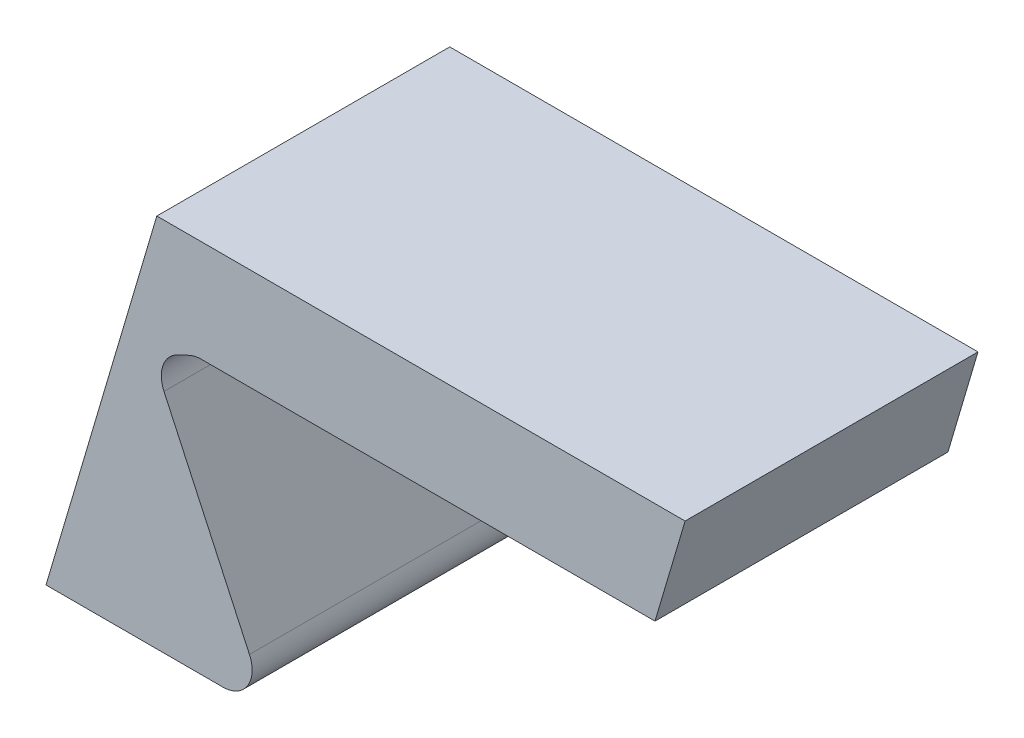
ISO-10303-21;
HEADER;
FILE_DESCRIPTION(('STEP AP214'),'2;1');
FILE_NAME('part.step','',(''),(''),'','','');
FILE_SCHEMA(('AUTOMOTIVE_DESIGN { 1 0 10303 214 1 1 1 1 }'));
ENDSEC;
DATA;
#1=APPLICATION_CONTEXT('core data for automotive mechanical design processes');
#2=APPLICATION_PROTOCOL_DEFINITION('international standard','automotive_design',2000,#1);
#3=PRODUCT_CONTEXT('',#1,'mechanical');
#4=PRODUCT('Part','Part','',(#3));
#5=PRODUCT_RELATED_PRODUCT_CATEGORY('part','',(#4));
#6=PRODUCT_DEFINITION_FORMATION('','',#4);
#7=PRODUCT_DEFINITION_CONTEXT('part definition',#1,'design');
#8=PRODUCT_DEFINITION('design','',#6,#7);
#9=PRODUCT_DEFINITION_SHAPE('','',#8);
#10=(LENGTH_UNIT() NAMED_UNIT(*) SI_UNIT(.MILLI.,.METRE.));
#11=(NAMED_UNIT(*) PLANE_ANGLE_UNIT() SI_UNIT($,.RADIAN.));
#12=(NAMED_UNIT(*) SI_UNIT($,.STERADIAN.) SOLID_ANGLE_UNIT());
#13=UNCERTAINTY_MEASURE_WITH_UNIT(LENGTH_MEASURE(1.E-05),#10,'distance_accuracy_value','');
#14=(GEOMETRIC_REPRESENTATION_CONTEXT(3) GLOBAL_UNCERTAINTY_ASSIGNED_CONTEXT((#13)) GLOBAL_UNIT_ASSIGNED_CONTEXT((#10,
#11,#12)) REPRESENTATION_CONTEXT('',''));
#15=CARTESIAN_POINT('',(0.,0.,0.));
#16=DIRECTION('',(0.,0.,1.));
#17=DIRECTION('',(1.,0.,0.));
#18=AXIS2_PLACEMENT_3D('',#15,#16,#17);
#19=CARTESIAN_POINT('',(-2.341839025816,-1.867497966332,0.));
#20=DIRECTION('',(0.,0.,1.));
#21=DIRECTION('',(0.842412213008179,-0.538833613812894,0.));
#22=AXIS2_PLACEMENT_3D('',#19,#20,#21);
#23=CYLINDRICAL_SURFACE('',#22,0.01);
#24=CARTESIAN_POINT('',(-2.341839025816,-1.867497966332,0.1));
#25=DIRECTION('',(0.,0.,-1.));
#26=DIRECTION('',(0.842412213008179,-0.538833613812894,0.));
#27=AXIS2_PLACEMENT_3D('',#24,#25,#26);
#28=CIRCLE('',#27,0.01);
#29=CARTESIAN_POINT('',(-2.332760625475,-1.8633047996,0.1));
#30=VERTEX_POINT('',#29);
#31=CARTESIAN_POINT('',(-2.341839025816,-1.877497966332,0.1));
#32=VERTEX_POINT('',#31);
#33=EDGE_CURVE('E11',#30,#32,#28,.T.);
#34=ORIENTED_EDGE('',*,*,#33,.T.);
#35=DIRECTION('',(0.,0.,-1.));
#36=VECTOR('',#35,1.);
#37=CARTESIAN_POINT('',(-2.341839025816,-1.877497966332,0.));
#38=LINE('',#37,#36);
#39=CARTESIAN_POINT('',(-2.341839025816,-1.877497966332,0.));
#40=VERTEX_POINT('',#39);
#41=EDGE_CURVE('E24',#32,#40,#38,.T.);
#42=ORIENTED_EDGE('',*,*,#41,.T.);
#43=CARTESIAN_POINT('',(-2.341839025816,-1.867497966332,0.));
#44=DIRECTION('',(0.,0.,1.));
#45=DIRECTION('',(0.842412213008179,-0.538833613812894,0.));
#46=AXIS2_PLACEMENT_3D('',#43,#44,#45);
#47=CIRCLE('',#46,0.01);
#48=CARTESIAN_POINT('',(-2.332760625475,-1.8633047996,0.));
#49=VERTEX_POINT('',#48);
#50=EDGE_CURVE('E174',#40,#49,#47,.T.);
#51=ORIENTED_EDGE('',*,*,#50,.T.);
#52=DIRECTION('',(0.,0.,1.));
#53=VECTOR('',#52,1.);
#54=CARTESIAN_POINT('',(-2.332760625475,-1.8633047996,0.));
#55=LINE('',#54,#53);
#56=EDGE_CURVE('E172',#49,#30,#55,.T.);
#57=ORIENTED_EDGE('',*,*,#56,.T.);
#58=EDGE_LOOP('',(#34,#42,#51,#57));
#59=FACE_BOUND('',#58,.T.);
#60=ADVANCED_FACE('F17',(#59),#23,.T.);
#61=CARTESIAN_POINT('',(-2.312122349708,-1.797075461806,0.));
#62=DIRECTION('',(0.,0.,1.));
#63=DIRECTION('',(1.,0.,0.));
#64=AXIS2_PLACEMENT_3D('',#61,#62,#63);
#65=PLANE('',#64);
#66=ORIENTED_EDGE('',*,*,#50,.F.);
#67=DIRECTION('',(1.,0.,0.));
#68=VECTOR('',#67,1.);
#69=CARTESIAN_POINT('',(-2.402222959671,-1.877497966332,0.));
#70=LINE('',#69,#68);
#71=CARTESIAN_POINT('',(-2.402222959671,-1.877497966332,0.));
#72=VERTEX_POINT('',#71);
#73=EDGE_CURVE('E169',#72,#40,#70,.T.);
#74=ORIENTED_EDGE('',*,*,#73,.F.);
#75=DIRECTION('',(-0.283427278082506,-0.958993732012228,0.));
#76=VECTOR('',#75,1.);
#77=CARTESIAN_POINT('',(-2.364390002153,-1.749487813712,0.));
#78=LINE('',#77,#76);
#79=CARTESIAN_POINT('',(-2.364390002153,-1.749487813712,0.));
#80=VERTEX_POINT('',#79);
#81=EDGE_CURVE('E167',#80,#72,#78,.T.);
#82=ORIENTED_EDGE('',*,*,#81,.F.);
#83=DIRECTION('',(-1.,0.,0.));
#84=VECTOR('',#83,1.);
#85=CARTESIAN_POINT('',(-2.184037518721,-1.749487813712,0.));
#86=LINE('',#85,#84);
#87=CARTESIAN_POINT('',(-2.184037518721,-1.749487813712,0.));
#88=VERTEX_POINT('',#87);
#89=EDGE_CURVE('E107',#88,#80,#86,.T.);
#90=ORIENTED_EDGE('',*,*,#89,.F.);
#91=DIRECTION('',(0.283427278082505,0.958993732012229,0.));
#92=VECTOR('',#91,1.);
#93=CARTESIAN_POINT('',(-2.194307302675,-1.784236263145,0.));
#94=LINE('',#93,#92);
#95=CARTESIAN_POINT('',(-2.194307302675,-1.784236263145,0.));
#96=VERTEX_POINT('',#95);
#97=EDGE_CURVE('E163',#96,#88,#94,.T.);
#98=ORIENTED_EDGE('',*,*,#97,.F.);
#99=DIRECTION('',(1.,0.,0.));
#100=VECTOR('',#99,1.);
#101=CARTESIAN_POINT('',(-2.351371947768,-1.784236263145,0.));
#102=LINE('',#101,#100);
#103=CARTESIAN_POINT('',(-2.349174087016,-1.784236263145,0.));
#104=VERTEX_POINT('',#103);
#105=EDGE_CURVE('E160',#104,#96,#102,.T.);
#106=ORIENTED_EDGE('',*,*,#105,.F.);
#107=CARTESIAN_POINT('',(-2.349174087016,-1.794236263145,0.));
#108=DIRECTION('',(0.,0.,-1.));
#109=DIRECTION('',(-0.214662486114045,0.976688290630812,0.));
#110=AXIS2_PLACEMENT_3D('',#107,#108,#109);
#111=CIRCLE('',#110,0.01);
#112=CARTESIAN_POINT('',(-2.353367253748,-1.785157862804,0.));
#113=VERTEX_POINT('',#112);
#114=EDGE_CURVE('E157',#113,#104,#111,.T.);
#115=ORIENTED_EDGE('',*,*,#114,.F.);
#116=DIRECTION('',(0.907840034110671,0.419316673250583,0.));
#117=VECTOR('',#116,1.);
#118=CARTESIAN_POINT('',(-2.366132203136,-1.791053787097,0.));
#119=LINE('',#118,#117);
#120=CARTESIAN_POINT('',(-2.357053802795,-1.786860620364,0.));
#121=VERTEX_POINT('',#120);
#122=EDGE_CURVE('E154',#121,#113,#119,.T.);
#123=ORIENTED_EDGE('',*,*,#122,.F.);
#124=CARTESIAN_POINT('',(-2.352860636062,-1.795939020706,0.));
#125=DIRECTION('',(0.,0.,-1.));
#126=DIRECTION('',(-0.938441507472356,0.345438181232202,0.));
#127=AXIS2_PLACEMENT_3D('',#124,#125,#126);
#128=CIRCLE('',#127,0.01);
#129=CARTESIAN_POINT('',(-2.361939036403,-1.800132187438,0.));
#130=VERTEX_POINT('',#129);
#131=EDGE_CURVE('E151',#130,#121,#128,.T.);
#132=ORIENTED_EDGE('',*,*,#131,.F.);
#133=DIRECTION('',(-0.419316673250588,0.907840034110668,0.));
#134=VECTOR('',#133,1.);
#135=CARTESIAN_POINT('',(-2.32620503062,-1.877497966332,0.));
#136=LINE('',#135,#134);
#137=EDGE_CURVE('E148',#49,#130,#136,.T.);
#138=ORIENTED_EDGE('',*,*,#137,.F.);
#139=EDGE_LOOP('',(#66,#74,#82,#90,#98,#106,#115,#123,#132,#138));
#140=FACE_BOUND('',#139,.T.);
#141=ADVANCED_FACE('F180',(#140),#65,.F.);
#142=CARTESIAN_POINT('',(-2.402222959671,-1.877497966332,0.));
#143=DIRECTION('',(0.,-1.,0.));
#144=DIRECTION('',(1.,0.,0.));
#145=AXIS2_PLACEMENT_3D('',#142,#143,#144);
#146=PLANE('',#145);
#147=ORIENTED_EDGE('',*,*,#41,.F.);
#148=DIRECTION('',(1.,0.,0.));
#149=VECTOR('',#148,1.);
#150=CARTESIAN_POINT('',(-2.402222959671,-1.877497966332,0.1));
#151=LINE('',#150,#149);
#152=CARTESIAN_POINT('',(-2.402222959671,-1.877497966332,0.1));
#153=VERTEX_POINT('',#152);
#154=EDGE_CURVE('E146',#153,#32,#151,.T.);
#155=ORIENTED_EDGE('',*,*,#154,.F.);
#156=DIRECTION('',(0.,0.,1.));
#157=VECTOR('',#156,1.);
#158=CARTESIAN_POINT('',(-2.402222959671,-1.877497966332,0.));
#159=LINE('',#158,#157);
#160=EDGE_CURVE('E97',#72,#153,#159,.T.);
#161=ORIENTED_EDGE('',*,*,#160,.F.);
#162=ORIENTED_EDGE('',*,*,#73,.T.);
#163=EDGE_LOOP('',(#147,#155,#161,#162));
#164=FACE_BOUND('',#163,.T.);
#165=ADVANCED_FACE('F181',(#164),#146,.T.);
#166=CARTESIAN_POINT('',(-2.349174087016,-1.794236263145,0.));
#167=DIRECTION('',(0.,0.,1.));
#168=DIRECTION('',(-0.214662486114045,0.976688290630812,0.));
#169=AXIS2_PLACEMENT_3D('',#166,#167,#168);
#170=CYLINDRICAL_SURFACE('',#169,0.01);
#171=ORIENTED_EDGE('',*,*,#114,.T.);
#172=DIRECTION('',(0.,0.,1.));
#173=VECTOR('',#172,1.);
#174=CARTESIAN_POINT('',(-2.349174087016,-1.784236263145,0.));
#175=LINE('',#174,#173);
#176=CARTESIAN_POINT('',(-2.349174087016,-1.784236263145,0.1));
#177=VERTEX_POINT('',#176);
#178=EDGE_CURVE('E142',#104,#177,#175,.T.);
#179=ORIENTED_EDGE('',*,*,#178,.T.);
#180=CARTESIAN_POINT('',(-2.349174087016,-1.794236263145,0.1));
#181=DIRECTION('',(0.,0.,1.));
#182=DIRECTION('',(-0.214662486114045,0.976688290630812,0.));
#183=AXIS2_PLACEMENT_3D('',#180,#181,#182);
#184=CIRCLE('',#183,0.01);
#185=CARTESIAN_POINT('',(-2.353367253748,-1.785157862804,0.1));
#186=VERTEX_POINT('',#185);
#187=EDGE_CURVE('E139',#177,#186,#184,.T.);
#188=ORIENTED_EDGE('',*,*,#187,.T.);
#189=DIRECTION('',(0.,0.,-1.));
#190=VECTOR('',#189,1.);
#191=CARTESIAN_POINT('',(-2.353367253748,-1.785157862804,0.));
#192=LINE('',#191,#190);
#193=EDGE_CURVE('E136',#186,#113,#192,.T.);
#194=ORIENTED_EDGE('',*,*,#193,.T.);
#195=EDGE_LOOP('',(#171,#179,#188,#194));
#196=FACE_BOUND('',#195,.T.);
#197=ADVANCED_FACE('F183',(#196),#170,.F.);
#198=CARTESIAN_POINT('',(-2.351371947768,-1.784236263145,0.));
#199=DIRECTION('',(0.,-1.,0.));
#200=DIRECTION('',(1.,0.,0.));
#201=AXIS2_PLACEMENT_3D('',#198,#199,#200);
#202=PLANE('',#201);
#203=ORIENTED_EDGE('',*,*,#178,.F.);
#204=ORIENTED_EDGE('',*,*,#105,.T.);
#205=DIRECTION('',(0.,0.,1.));
#206=VECTOR('',#205,1.);
#207=CARTESIAN_POINT('',(-2.194307302675,-1.784236263145,0.));
#208=LINE('',#207,#206);
#209=CARTESIAN_POINT('',(-2.194307302675,-1.784236263145,0.1));
#210=VERTEX_POINT('',#209);
#211=EDGE_CURVE('E134',#96,#210,#208,.T.);
#212=ORIENTED_EDGE('',*,*,#211,.T.);
#213=DIRECTION('',(1.,0.,0.));
#214=VECTOR('',#213,1.);
#215=CARTESIAN_POINT('',(-2.351371947768,-1.784236263145,0.1));
#216=LINE('',#215,#214);
#217=EDGE_CURVE('E132',#177,#210,#216,.T.);
#218=ORIENTED_EDGE('',*,*,#217,.F.);
#219=EDGE_LOOP('',(#203,#204,#212,#218));
#220=FACE_BOUND('',#219,.T.);
#221=ADVANCED_FACE('F190',(#220),#202,.T.);
#222=CARTESIAN_POINT('',(-2.352860636062,-1.795939020706,0.));
#223=DIRECTION('',(0.,0.,1.));
#224=DIRECTION('',(-0.938441507472356,0.345438181232202,0.));
#225=AXIS2_PLACEMENT_3D('',#222,#223,#224);
#226=CYLINDRICAL_SURFACE('',#225,0.01);
#227=ORIENTED_EDGE('',*,*,#131,.T.);
#228=DIRECTION('',(0.,0.,1.));
#229=VECTOR('',#228,1.);
#230=CARTESIAN_POINT('',(-2.357053802795,-1.786860620364,0.));
#231=LINE('',#230,#229);
#232=CARTESIAN_POINT('',(-2.357053802795,-1.786860620364,0.1));
#233=VERTEX_POINT('',#232);
#234=EDGE_CURVE('E129',#121,#233,#231,.T.);
#235=ORIENTED_EDGE('',*,*,#234,.T.);
#236=CARTESIAN_POINT('',(-2.352860636062,-1.795939020706,0.1));
#237=DIRECTION('',(0.,0.,1.));
#238=DIRECTION('',(-0.938441507472356,0.345438181232202,0.));
#239=AXIS2_PLACEMENT_3D('',#236,#237,#238);
#240=CIRCLE('',#239,0.01);
#241=CARTESIAN_POINT('',(-2.361939036403,-1.800132187438,0.1));
#242=VERTEX_POINT('',#241);
#243=EDGE_CURVE('E126',#233,#242,#240,.T.);
#244=ORIENTED_EDGE('',*,*,#243,.T.);
#245=DIRECTION('',(0.,0.,-1.));
#246=VECTOR('',#245,1.);
#247=CARTESIAN_POINT('',(-2.361939036403,-1.800132187438,0.));
#248=LINE('',#247,#246);
#249=EDGE_CURVE('E123',#242,#130,#248,.T.);
#250=ORIENTED_EDGE('',*,*,#249,.T.);
#251=EDGE_LOOP('',(#227,#235,#244,#250));
#252=FACE_BOUND('',#251,.T.);
#253=ADVANCED_FACE('F227',(#252),#226,.F.);
#254=CARTESIAN_POINT('',(-2.366132203136,-1.791053787097,0.));
#255=DIRECTION('',(0.419316673250583,-0.907840034110671,0.));
#256=DIRECTION('',(0.907840034110671,0.419316673250583,0.));
#257=AXIS2_PLACEMENT_3D('',#254,#255,#256);
#258=PLANE('',#257);
#259=ORIENTED_EDGE('',*,*,#193,.F.);
#260=DIRECTION('',(0.907840034110671,0.419316673250583,0.));
#261=VECTOR('',#260,1.);
#262=CARTESIAN_POINT('',(-2.366132203136,-1.791053787097,0.1));
#263=LINE('',#262,#261);
#264=EDGE_CURVE('E120',#233,#186,#263,.T.);
#265=ORIENTED_EDGE('',*,*,#264,.F.);
#266=ORIENTED_EDGE('',*,*,#234,.F.);
#267=ORIENTED_EDGE('',*,*,#122,.T.);
#268=EDGE_LOOP('',(#259,#265,#266,#267));
#269=FACE_BOUND('',#268,.T.);
#270=ADVANCED_FACE('F237',(#269),#258,.T.);
#271=CARTESIAN_POINT('',(-2.194307302675,-1.784236263145,0.));
#272=DIRECTION('',(0.958993732012229,-0.283427278082505,0.));
#273=DIRECTION('',(0.283427278082505,0.958993732012229,0.));
#274=AXIS2_PLACEMENT_3D('',#271,#272,#273);
#275=PLANE('',#274);
#276=ORIENTED_EDGE('',*,*,#97,.T.);
#277=DIRECTION('',(0.,0.,1.));
#278=VECTOR('',#277,1.);
#279=CARTESIAN_POINT('',(-2.184037518721,-1.749487813712,0.));
#280=LINE('',#279,#278);
#281=CARTESIAN_POINT('',(-2.184037518721,-1.749487813712,0.1));
#282=VERTEX_POINT('',#281);
#283=EDGE_CURVE('E118',#88,#282,#280,.T.);
#284=ORIENTED_EDGE('',*,*,#283,.T.);
#285=DIRECTION('',(0.283427278082505,0.958993732012229,0.));
#286=VECTOR('',#285,1.);
#287=CARTESIAN_POINT('',(-2.194307302675,-1.784236263145,0.1));
#288=LINE('',#287,#286);
#289=EDGE_CURVE('E113',#210,#282,#288,.T.);
#290=ORIENTED_EDGE('',*,*,#289,.F.);
#291=ORIENTED_EDGE('',*,*,#211,.F.);
#292=EDGE_LOOP('',(#276,#284,#290,#291));
#293=FACE_BOUND('',#292,.T.);
#294=ADVANCED_FACE('F247',(#293),#275,.T.);
#295=CARTESIAN_POINT('',(-2.32620503062,-1.877497966332,0.));
#296=DIRECTION('',(0.907840034110669,0.419316673250588,0.));
#297=DIRECTION('',(-0.419316673250588,0.907840034110669,0.));
#298=AXIS2_PLACEMENT_3D('',#295,#296,#297);
#299=PLANE('',#298);
#300=ORIENTED_EDGE('',*,*,#56,.F.);
#301=ORIENTED_EDGE('',*,*,#137,.T.);
#302=ORIENTED_EDGE('',*,*,#249,.F.);
#303=DIRECTION('',(-0.419316673250588,0.907840034110668,0.));
#304=VECTOR('',#303,1.);
#305=CARTESIAN_POINT('',(-2.32620503062,-1.877497966332,0.1));
#306=LINE('',#305,#304);
#307=EDGE_CURVE('E99',#30,#242,#306,.T.);
#308=ORIENTED_EDGE('',*,*,#307,.F.);
#309=EDGE_LOOP('',(#300,#301,#302,#308));
#310=FACE_BOUND('',#309,.T.);
#311=ADVANCED_FACE('F257',(#310),#299,.T.);
#312=CARTESIAN_POINT('',(-2.364390002153,-1.749487813712,0.));
#313=DIRECTION('',(-0.958993732012229,0.283427278082506,0.));
#314=DIRECTION('',(-0.283427278082506,-0.958993732012229,0.));
#315=AXIS2_PLACEMENT_3D('',#312,#313,#314);
#316=PLANE('',#315);
#317=ORIENTED_EDGE('',*,*,#81,.T.);
#318=ORIENTED_EDGE('',*,*,#160,.T.);
#319=DIRECTION('',(-0.283427278082506,-0.958993732012228,0.));
#320=VECTOR('',#319,1.);
#321=CARTESIAN_POINT('',(-2.364390002153,-1.749487813712,0.1));
#322=LINE('',#321,#320);
#323=CARTESIAN_POINT('',(-2.364390002153,-1.749487813712,0.1));
#324=VERTEX_POINT('',#323);
#325=EDGE_CURVE('E91',#324,#153,#322,.T.);
#326=ORIENTED_EDGE('',*,*,#325,.F.);
#327=DIRECTION('',(0.,0.,1.));
#328=VECTOR('',#327,1.);
#329=CARTESIAN_POINT('',(-2.364390002153,-1.749487813712,0.));
#330=LINE('',#329,#328);
#331=EDGE_CURVE('E95',#80,#324,#330,.T.);
#332=ORIENTED_EDGE('',*,*,#331,.F.);
#333=EDGE_LOOP('',(#317,#318,#326,#332));
#334=FACE_BOUND('',#333,.T.);
#335=ADVANCED_FACE('F94',(#334),#316,.T.);
#336=CARTESIAN_POINT('',(-2.184037518721,-1.749487813712,0.));
#337=DIRECTION('',(0.,1.,0.));
#338=DIRECTION('',(-1.,0.,0.));
#339=AXIS2_PLACEMENT_3D('',#336,#337,#338);
#340=PLANE('',#339);
#341=ORIENTED_EDGE('',*,*,#89,.T.);
#342=ORIENTED_EDGE('',*,*,#331,.T.);
#343=DIRECTION('',(-1.,0.,0.));
#344=VECTOR('',#343,1.);
#345=CARTESIAN_POINT('',(-2.184037518721,-1.749487813712,0.1));
#346=LINE('',#345,#344);
#347=EDGE_CURVE('E106',#282,#324,#346,.T.);
#348=ORIENTED_EDGE('',*,*,#347,.F.);
#349=ORIENTED_EDGE('',*,*,#283,.F.);
#350=EDGE_LOOP('',(#341,#342,#348,#349));
#351=FACE_BOUND('',#350,.T.);
#352=ADVANCED_FACE('F104',(#351),#340,.T.);
#353=CARTESIAN_POINT('',(-2.312122349708,-1.797075461806,0.1));
#354=DIRECTION('',(0.,0.,1.));
#355=DIRECTION('',(1.,0.,0.));
#356=AXIS2_PLACEMENT_3D('',#353,#354,#355);
#357=PLANE('',#356);
#358=ORIENTED_EDGE('',*,*,#33,.F.);
#359=ORIENTED_EDGE('',*,*,#307,.T.);
#360=ORIENTED_EDGE('',*,*,#243,.F.);
#361=ORIENTED_EDGE('',*,*,#264,.T.);
#362=ORIENTED_EDGE('',*,*,#187,.F.);
#363=ORIENTED_EDGE('',*,*,#217,.T.);
#364=ORIENTED_EDGE('',*,*,#289,.T.);
#365=ORIENTED_EDGE('',*,*,#347,.T.);
#366=ORIENTED_EDGE('',*,*,#325,.T.);
#367=ORIENTED_EDGE('',*,*,#154,.T.);
#368=EDGE_LOOP('',(#358,#359,#360,#361,#362,#363,#364,#365,#366,#367));
#369=FACE_BOUND('',#368,.T.);
#370=ADVANCED_FACE('F110',(#369),#357,.T.);
#371=CLOSED_SHELL('',(#60,#141,#165,#197,#221,#253,#270,#294,#311,#335,#352,#370));
#372=MANIFOLD_SOLID_BREP('B1',#371);
#373=ADVANCED_BREP_SHAPE_REPRESENTATION('',(#18,#372),#14);
#374=SHAPE_DEFINITION_REPRESENTATION(#9,#373);
ENDSEC;
END-ISO-10303-21;
